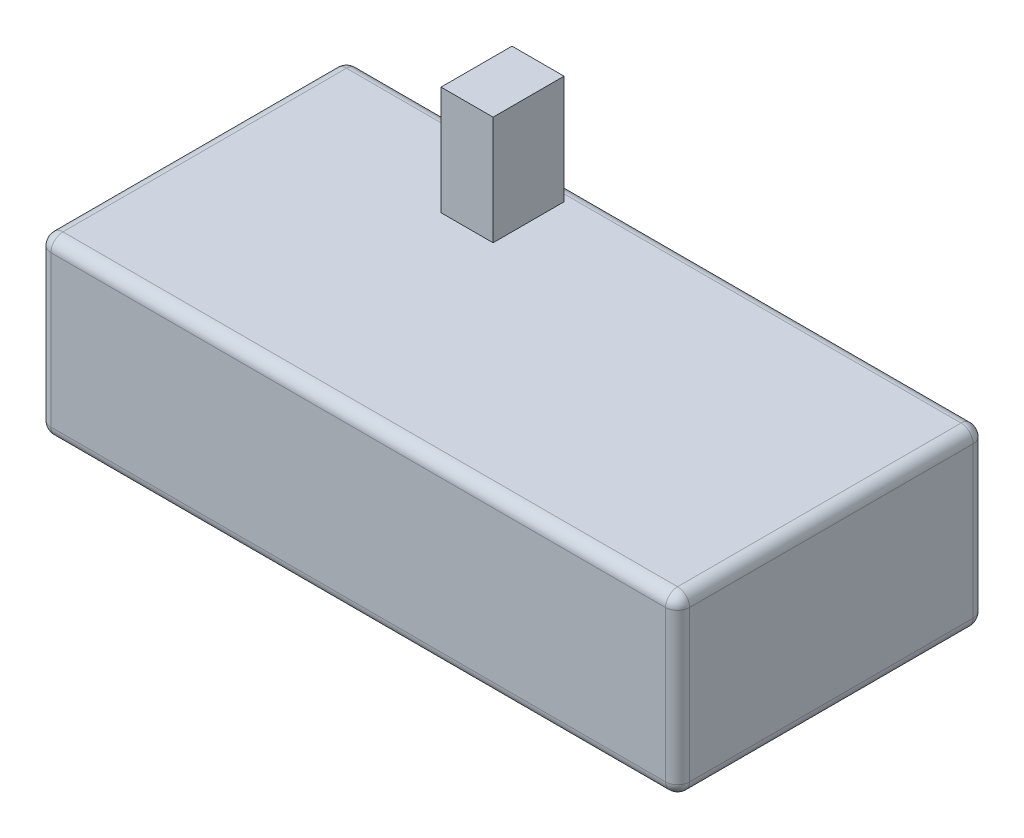
ISO-10303-21;
HEADER;
FILE_DESCRIPTION(('STEP AP214'),'2;1');
FILE_NAME('part.step','',(''),(''),'','','');
FILE_SCHEMA(('AUTOMOTIVE_DESIGN { 1 0 10303 214 1 1 1 1 }'));
ENDSEC;
DATA;
#1=APPLICATION_CONTEXT('core data for automotive mechanical design processes');
#2=APPLICATION_PROTOCOL_DEFINITION('international standard','automotive_design',2000,#1);
#3=PRODUCT_CONTEXT('',#1,'mechanical');
#4=PRODUCT('Part','Part','',(#3));
#5=PRODUCT_RELATED_PRODUCT_CATEGORY('part','',(#4));
#6=PRODUCT_DEFINITION_FORMATION('','',#4);
#7=PRODUCT_DEFINITION_CONTEXT('part definition',#1,'design');
#8=PRODUCT_DEFINITION('design','',#6,#7);
#9=PRODUCT_DEFINITION_SHAPE('','',#8);
#10=(LENGTH_UNIT() NAMED_UNIT(*) SI_UNIT(.MILLI.,.METRE.));
#11=(NAMED_UNIT(*) PLANE_ANGLE_UNIT() SI_UNIT($,.RADIAN.));
#12=(NAMED_UNIT(*) SI_UNIT($,.STERADIAN.) SOLID_ANGLE_UNIT());
#13=UNCERTAINTY_MEASURE_WITH_UNIT(LENGTH_MEASURE(1.E-05),#10,'distance_accuracy_value','');
#14=(GEOMETRIC_REPRESENTATION_CONTEXT(3) GLOBAL_UNCERTAINTY_ASSIGNED_CONTEXT((#13)) GLOBAL_UNIT_ASSIGNED_CONTEXT((#10,
#11,#12)) REPRESENTATION_CONTEXT('',''));
#15=CARTESIAN_POINT('',(0.,0.,0.));
#16=DIRECTION('',(0.,0.,1.));
#17=DIRECTION('',(1.,0.,0.));
#18=AXIS2_PLACEMENT_3D('',#15,#16,#17);
#19=CARTESIAN_POINT('',(0.,37.,0.));
#20=DIRECTION('',(0.,0.,1.));
#21=DIRECTION('',(1.,0.,0.));
#22=AXIS2_PLACEMENT_3D('',#19,#20,#21);
#23=PLANE('',#22);
#24=DIRECTION('',(0.,-1.,0.));
#25=VECTOR('',#24,1.);
#26=CARTESIAN_POINT('',(132.46,37.,0.));
#27=LINE('',#26,#25);
#28=CARTESIAN_POINT('',(132.46,34.46,0.));
#29=VERTEX_POINT('',#28);
#30=CARTESIAN_POINT('',(132.46,2.54,0.));
#31=VERTEX_POINT('',#30);
#32=EDGE_CURVE('E300',#29,#31,#27,.T.);
#33=ORIENTED_EDGE('',*,*,#32,.T.);
#34=DIRECTION('',(-1.,0.,0.));
#35=VECTOR('',#34,1.);
#36=CARTESIAN_POINT('',(0.,2.54,0.));
#37=LINE('',#36,#35);
#38=CARTESIAN_POINT('',(2.54,2.54,0.));
#39=VERTEX_POINT('',#38);
#40=EDGE_CURVE('E304',#31,#39,#37,.T.);
#41=ORIENTED_EDGE('',*,*,#40,.T.);
#42=DIRECTION('',(0.,-1.,0.));
#43=VECTOR('',#42,1.);
#44=CARTESIAN_POINT('',(2.54,37.,0.));
#45=LINE('',#44,#43);
#46=CARTESIAN_POINT('',(2.54,34.46,0.));
#47=VERTEX_POINT('',#46);
#48=EDGE_CURVE('E302',#39,#47,#45,.F.);
#49=ORIENTED_EDGE('',*,*,#48,.T.);
#50=DIRECTION('',(-1.,0.,0.));
#51=VECTOR('',#50,1.);
#52=CARTESIAN_POINT('',(135.,34.46,0.));
#53=LINE('',#52,#51);
#54=EDGE_CURVE('E298',#47,#29,#53,.F.);
#55=ORIENTED_EDGE('',*,*,#54,.T.);
#56=EDGE_LOOP('',(#33,#41,#49,#55));
#57=FACE_BOUND('',#56,.T.);
#58=DIRECTION('',(0.,-1.,0.));
#59=VECTOR('',#58,1.);
#60=CARTESIAN_POINT('',(66.,12.,0.));
#61=LINE('',#60,#59);
#62=CARTESIAN_POINT('',(66.,12.,0.));
#63=VERTEX_POINT('',#62);
#64=CARTESIAN_POINT('',(66.,8.,0.));
#65=VERTEX_POINT('',#64);
#66=EDGE_CURVE('E235',#63,#65,#61,.T.);
#67=ORIENTED_EDGE('',*,*,#66,.F.);
#68=DIRECTION('',(1.,0.,0.));
#69=VECTOR('',#68,1.);
#70=CARTESIAN_POINT('',(66.,12.,0.));
#71=LINE('',#70,#69);
#72=CARTESIAN_POINT('',(53.,12.,0.));
#73=VERTEX_POINT('',#72);
#74=EDGE_CURVE('E240',#73,#63,#71,.T.);
#75=ORIENTED_EDGE('',*,*,#74,.F.);
#76=DIRECTION('',(0.,1.,0.));
#77=VECTOR('',#76,1.);
#78=CARTESIAN_POINT('',(53.,12.,0.));
#79=LINE('',#78,#77);
#80=CARTESIAN_POINT('',(53.,8.00000000000001,0.));
#81=VERTEX_POINT('',#80);
#82=EDGE_CURVE('E252',#81,#73,#79,.T.);
#83=ORIENTED_EDGE('',*,*,#82,.F.);
#84=DIRECTION('',(-1.,0.,0.));
#85=VECTOR('',#84,1.);
#86=CARTESIAN_POINT('',(66.,8.,0.));
#87=LINE('',#86,#85);
#88=EDGE_CURVE('E249',#65,#81,#87,.T.);
#89=ORIENTED_EDGE('',*,*,#88,.F.);
#90=EDGE_LOOP('',(#67,#75,#83,#89));
#91=FACE_BOUND('',#90,.T.);
#92=ADVANCED_FACE('F35',(#57,#91),#23,.F.);
#93=CARTESIAN_POINT('',(0.,37.,0.));
#94=DIRECTION('',(0.,1.,0.));
#95=DIRECTION('',(0.,0.,1.));
#96=AXIS2_PLACEMENT_3D('',#93,#94,#95);
#97=PLANE('',#96);
#98=DIRECTION('',(0.,0.,-1.));
#99=VECTOR('',#98,1.);
#100=CARTESIAN_POINT('',(132.46,37.,0.));
#101=LINE('',#100,#99);
#102=CARTESIAN_POINT('',(132.46,37.,62.46));
#103=VERTEX_POINT('',#102);
#104=CARTESIAN_POINT('',(132.46,37.,2.54));
#105=VERTEX_POINT('',#104);
#106=EDGE_CURVE('E44',#103,#105,#101,.T.);
#107=ORIENTED_EDGE('',*,*,#106,.T.);
#108=DIRECTION('',(-1.,0.,0.));
#109=VECTOR('',#108,1.);
#110=CARTESIAN_POINT('',(0.,37.,2.54));
#111=LINE('',#110,#109);
#112=CARTESIAN_POINT('',(2.54,37.,2.54));
#113=VERTEX_POINT('',#112);
#114=EDGE_CURVE('E11',#105,#113,#111,.T.);
#115=ORIENTED_EDGE('',*,*,#114,.T.);
#116=DIRECTION('',(0.,0.,1.));
#117=VECTOR('',#116,1.);
#118=CARTESIAN_POINT('',(2.54,37.,65.));
#119=LINE('',#118,#117);
#120=CARTESIAN_POINT('',(2.54,37.,62.46));
#121=VERTEX_POINT('',#120);
#122=EDGE_CURVE('E343',#113,#121,#119,.T.);
#123=ORIENTED_EDGE('',*,*,#122,.T.);
#124=DIRECTION('',(1.,0.,0.));
#125=VECTOR('',#124,1.);
#126=CARTESIAN_POINT('',(135.,37.,62.46));
#127=LINE('',#126,#125);
#128=EDGE_CURVE('E345',#121,#103,#127,.T.);
#129=ORIENTED_EDGE('',*,*,#128,.T.);
#130=EDGE_LOOP('',(#107,#115,#123,#129));
#131=FACE_BOUND('',#130,.T.);
#132=DIRECTION('',(-1.,0.,0.));
#133=VECTOR('',#132,1.);
#134=CARTESIAN_POINT('',(50.,37.,4.));
#135=LINE('',#134,#133);
#136=CARTESIAN_POINT('',(50.,37.,4.));
#137=VERTEX_POINT('',#136);
#138=CARTESIAN_POINT('',(39.,37.,4.00000000000001));
#139=VERTEX_POINT('',#138);
#140=EDGE_CURVE('E282',#137,#139,#135,.T.);
#141=ORIENTED_EDGE('',*,*,#140,.F.);
#142=DIRECTION('',(0.,0.,-1.));
#143=VECTOR('',#142,1.);
#144=CARTESIAN_POINT('',(50.,37.,19.));
#145=LINE('',#144,#143);
#146=CARTESIAN_POINT('',(50.,37.,19.));
#147=VERTEX_POINT('',#146);
#148=EDGE_CURVE('E268',#147,#137,#145,.T.);
#149=ORIENTED_EDGE('',*,*,#148,.F.);
#150=DIRECTION('',(1.,0.,0.));
#151=VECTOR('',#150,1.);
#152=CARTESIAN_POINT('',(50.,37.,19.));
#153=LINE('',#152,#151);
#154=CARTESIAN_POINT('',(39.,37.,19.));
#155=VERTEX_POINT('',#154);
#156=EDGE_CURVE('E273',#155,#147,#153,.T.);
#157=ORIENTED_EDGE('',*,*,#156,.F.);
#158=DIRECTION('',(0.,0.,1.));
#159=VECTOR('',#158,1.);
#160=CARTESIAN_POINT('',(39.,37.,19.));
#161=LINE('',#160,#159);
#162=EDGE_CURVE('E284',#139,#155,#161,.T.);
#163=ORIENTED_EDGE('',*,*,#162,.F.);
#164=EDGE_LOOP('',(#141,#149,#157,#163));
#165=FACE_BOUND('',#164,.T.);
#166=ADVANCED_FACE('F438',(#131,#165),#97,.T.);
#167=CARTESIAN_POINT('',(0.,37.,0.));
#168=DIRECTION('',(1.,0.,0.));
#169=DIRECTION('',(0.,0.,-1.));
#170=AXIS2_PLACEMENT_3D('',#167,#168,#169);
#171=PLANE('',#170);
#172=DIRECTION('',(0.,0.,1.));
#173=VECTOR('',#172,1.);
#174=CARTESIAN_POINT('',(0.,34.46,0.));
#175=LINE('',#174,#173);
#176=CARTESIAN_POINT('',(0.,34.46,62.46));
#177=VERTEX_POINT('',#176);
#178=CARTESIAN_POINT('',(0.,34.46,2.54));
#179=VERTEX_POINT('',#178);
#180=EDGE_CURVE('E316',#177,#179,#175,.F.);
#181=ORIENTED_EDGE('',*,*,#180,.T.);
#182=DIRECTION('',(0.,-1.,0.));
#183=VECTOR('',#182,1.);
#184=CARTESIAN_POINT('',(0.,37.,2.54));
#185=LINE('',#184,#183);
#186=CARTESIAN_POINT('',(0.,2.54,2.54));
#187=VERTEX_POINT('',#186);
#188=EDGE_CURVE('E322',#179,#187,#185,.T.);
#189=ORIENTED_EDGE('',*,*,#188,.T.);
#190=DIRECTION('',(0.,0.,1.));
#191=VECTOR('',#190,1.);
#192=CARTESIAN_POINT('',(0.,2.54,0.));
#193=LINE('',#192,#191);
#194=CARTESIAN_POINT('',(0.,2.54,62.46));
#195=VERTEX_POINT('',#194);
#196=EDGE_CURVE('E320',#187,#195,#193,.T.);
#197=ORIENTED_EDGE('',*,*,#196,.T.);
#198=DIRECTION('',(0.,-1.,0.));
#199=VECTOR('',#198,1.);
#200=CARTESIAN_POINT('',(0.,37.,62.46));
#201=LINE('',#200,#199);
#202=EDGE_CURVE('E318',#195,#177,#201,.F.);
#203=ORIENTED_EDGE('',*,*,#202,.T.);
#204=EDGE_LOOP('',(#181,#189,#197,#203));
#205=FACE_BOUND('',#204,.T.);
#206=ADVANCED_FACE('F500',(#205),#171,.F.);
#207=CARTESIAN_POINT('',(0.,37.,65.));
#208=DIRECTION('',(0.,0.,-1.));
#209=DIRECTION('',(-1.,0.,0.));
#210=AXIS2_PLACEMENT_3D('',#207,#208,#209);
#211=PLANE('',#210);
#212=DIRECTION('',(1.,0.,0.));
#213=VECTOR('',#212,1.);
#214=CARTESIAN_POINT('',(0.,34.46,65.));
#215=LINE('',#214,#213);
#216=CARTESIAN_POINT('',(132.46,34.46,65.));
#217=VERTEX_POINT('',#216);
#218=CARTESIAN_POINT('',(2.54,34.46,65.));
#219=VERTEX_POINT('',#218);
#220=EDGE_CURVE('E325',#217,#219,#215,.F.);
#221=ORIENTED_EDGE('',*,*,#220,.T.);
#222=DIRECTION('',(0.,-1.,0.));
#223=VECTOR('',#222,1.);
#224=CARTESIAN_POINT('',(2.54,37.,65.));
#225=LINE('',#224,#223);
#226=CARTESIAN_POINT('',(2.54,2.54,65.));
#227=VERTEX_POINT('',#226);
#228=EDGE_CURVE('E331',#219,#227,#225,.T.);
#229=ORIENTED_EDGE('',*,*,#228,.T.);
#230=DIRECTION('',(1.,0.,0.));
#231=VECTOR('',#230,1.);
#232=CARTESIAN_POINT('',(0.,2.54,65.));
#233=LINE('',#232,#231);
#234=CARTESIAN_POINT('',(132.46,2.54,65.));
#235=VERTEX_POINT('',#234);
#236=EDGE_CURVE('E329',#227,#235,#233,.T.);
#237=ORIENTED_EDGE('',*,*,#236,.T.);
#238=DIRECTION('',(0.,-1.,0.));
#239=VECTOR('',#238,1.);
#240=CARTESIAN_POINT('',(132.46,37.,65.));
#241=LINE('',#240,#239);
#242=EDGE_CURVE('E327',#235,#217,#241,.F.);
#243=ORIENTED_EDGE('',*,*,#242,.T.);
#244=EDGE_LOOP('',(#221,#229,#237,#243));
#245=FACE_BOUND('',#244,.T.);
#246=ADVANCED_FACE('F461',(#245),#211,.F.);
#247=CARTESIAN_POINT('',(135.,37.,0.));
#248=DIRECTION('',(-1.,0.,0.));
#249=DIRECTION('',(0.,0.,1.));
#250=AXIS2_PLACEMENT_3D('',#247,#248,#249);
#251=PLANE('',#250);
#252=DIRECTION('',(0.,-1.,0.));
#253=VECTOR('',#252,1.);
#254=CARTESIAN_POINT('',(135.,37.,62.46));
#255=LINE('',#254,#253);
#256=CARTESIAN_POINT('',(135.,34.46,62.46));
#257=VERTEX_POINT('',#256);
#258=CARTESIAN_POINT('',(135.,2.54,62.46));
#259=VERTEX_POINT('',#258);
#260=EDGE_CURVE('E338',#257,#259,#255,.T.);
#261=ORIENTED_EDGE('',*,*,#260,.T.);
#262=DIRECTION('',(0.,0.,-1.));
#263=VECTOR('',#262,1.);
#264=CARTESIAN_POINT('',(135.,2.54,0.));
#265=LINE('',#264,#263);
#266=CARTESIAN_POINT('',(135.,2.54,2.54));
#267=VERTEX_POINT('',#266);
#268=EDGE_CURVE('E341',#259,#267,#265,.T.);
#269=ORIENTED_EDGE('',*,*,#268,.T.);
#270=DIRECTION('',(0.,-1.,0.));
#271=VECTOR('',#270,1.);
#272=CARTESIAN_POINT('',(135.,37.,2.54));
#273=LINE('',#272,#271);
#274=CARTESIAN_POINT('',(135.,34.46,2.54));
#275=VERTEX_POINT('',#274);
#276=EDGE_CURVE('E336',#267,#275,#273,.F.);
#277=ORIENTED_EDGE('',*,*,#276,.T.);
#278=DIRECTION('',(0.,0.,-1.));
#279=VECTOR('',#278,1.);
#280=CARTESIAN_POINT('',(135.,34.46,65.));
#281=LINE('',#280,#279);
#282=EDGE_CURVE('E334',#275,#257,#281,.F.);
#283=ORIENTED_EDGE('',*,*,#282,.T.);
#284=EDGE_LOOP('',(#261,#269,#277,#283));
#285=FACE_BOUND('',#284,.T.);
#286=ADVANCED_FACE('F430',(#285),#251,.F.);
#287=CARTESIAN_POINT('',(0.,0.,0.));
#288=DIRECTION('',(0.,1.,0.));
#289=DIRECTION('',(0.,0.,1.));
#290=AXIS2_PLACEMENT_3D('',#287,#288,#289);
#291=PLANE('',#290);
#292=DIRECTION('',(0.,0.,1.));
#293=VECTOR('',#292,1.);
#294=CARTESIAN_POINT('',(2.54,0.,0.));
#295=LINE('',#294,#293);
#296=CARTESIAN_POINT('',(2.54,0.,62.46));
#297=VERTEX_POINT('',#296);
#298=CARTESIAN_POINT('',(2.54,0.,2.54));
#299=VERTEX_POINT('',#298);
#300=EDGE_CURVE('E311',#297,#299,#295,.F.);
#301=ORIENTED_EDGE('',*,*,#300,.T.);
#302=DIRECTION('',(-1.,0.,0.));
#303=VECTOR('',#302,1.);
#304=CARTESIAN_POINT('',(0.,0.,2.54));
#305=LINE('',#304,#303);
#306=CARTESIAN_POINT('',(132.46,0.,2.54));
#307=VERTEX_POINT('',#306);
#308=EDGE_CURVE('E313',#299,#307,#305,.F.);
#309=ORIENTED_EDGE('',*,*,#308,.T.);
#310=DIRECTION('',(0.,0.,-1.));
#311=VECTOR('',#310,1.);
#312=CARTESIAN_POINT('',(132.46,0.,0.));
#313=LINE('',#312,#311);
#314=CARTESIAN_POINT('',(132.46,0.,62.46));
#315=VERTEX_POINT('',#314);
#316=EDGE_CURVE('E307',#307,#315,#313,.F.);
#317=ORIENTED_EDGE('',*,*,#316,.T.);
#318=DIRECTION('',(1.,0.,0.));
#319=VECTOR('',#318,1.);
#320=CARTESIAN_POINT('',(0.,0.,62.46));
#321=LINE('',#320,#319);
#322=EDGE_CURVE('E309',#315,#297,#321,.F.);
#323=ORIENTED_EDGE('',*,*,#322,.T.);
#324=EDGE_LOOP('',(#301,#309,#317,#323));
#325=FACE_BOUND('',#324,.T.);
#326=ADVANCED_FACE('F505',(#325),#291,.F.);
#327=CARTESIAN_POINT('',(0.,34.46,62.46));
#328=DIRECTION('',(-1.,0.,0.));
#329=DIRECTION('',(0.,0.,1.));
#330=AXIS2_PLACEMENT_3D('',#327,#328,#329);
#331=CYLINDRICAL_SURFACE('',#330,2.54);
#332=CARTESIAN_POINT('',(132.46,34.46,62.46));
#333=DIRECTION('',(1.,0.,0.));
#334=DIRECTION('',(0.,0.,-1.));
#335=AXIS2_PLACEMENT_3D('',#332,#333,#334);
#336=CIRCLE('',#335,2.54);
#337=EDGE_CURVE('E39',#103,#217,#336,.T.);
#338=ORIENTED_EDGE('',*,*,#337,.F.);
#339=ORIENTED_EDGE('',*,*,#128,.F.);
#340=CARTESIAN_POINT('',(2.54,34.46,62.46));
#341=DIRECTION('',(-1.,0.,0.));
#342=DIRECTION('',(0.,0.,1.));
#343=AXIS2_PLACEMENT_3D('',#340,#341,#342);
#344=CIRCLE('',#343,2.54);
#345=EDGE_CURVE('E407',#219,#121,#344,.T.);
#346=ORIENTED_EDGE('',*,*,#345,.F.);
#347=ORIENTED_EDGE('',*,*,#220,.F.);
#348=EDGE_LOOP('',(#338,#339,#346,#347));
#349=FACE_BOUND('',#348,.T.);
#350=ADVANCED_FACE('F37',(#349),#331,.T.);
#351=CARTESIAN_POINT('',(132.46,34.46,62.46));
#352=DIRECTION('',(0.,0.,1.));
#353=DIRECTION('',(1.,0.,0.));
#354=AXIS2_PLACEMENT_3D('',#351,#352,#353);
#355=SPHERICAL_SURFACE('',#354,2.54);
#356=CARTESIAN_POINT('',(132.46,34.46,62.46));
#357=DIRECTION('',(0.,0.,1.));
#358=DIRECTION('',(1.,0.,0.));
#359=AXIS2_PLACEMENT_3D('',#356,#357,#358);
#360=CIRCLE('',#359,2.54);
#361=EDGE_CURVE('E402',#103,#257,#360,.F.);
#362=ORIENTED_EDGE('',*,*,#361,.F.);
#363=ORIENTED_EDGE('',*,*,#337,.T.);
#364=CARTESIAN_POINT('',(132.46,34.46,62.46));
#365=DIRECTION('',(0.,1.,0.));
#366=DIRECTION('',(0.,0.,1.));
#367=AXIS2_PLACEMENT_3D('',#364,#365,#366);
#368=CIRCLE('',#367,2.54);
#369=EDGE_CURVE('E405',#257,#217,#368,.F.);
#370=ORIENTED_EDGE('',*,*,#369,.F.);
#371=EDGE_LOOP('',(#362,#363,#370));
#372=FACE_BOUND('',#371,.T.);
#373=ADVANCED_FACE('F418',(#372),#355,.T.);
#374=CARTESIAN_POINT('',(2.54,34.46,62.46));
#375=DIRECTION('',(0.,0.,1.));
#376=DIRECTION('',(1.,0.,0.));
#377=AXIS2_PLACEMENT_3D('',#374,#375,#376);
#378=SPHERICAL_SURFACE('',#377,2.54);
#379=CARTESIAN_POINT('',(2.54,34.46,62.46));
#380=DIRECTION('',(0.,1.,0.));
#381=DIRECTION('',(0.,0.,1.));
#382=AXIS2_PLACEMENT_3D('',#379,#380,#381);
#383=CIRCLE('',#382,2.54);
#384=EDGE_CURVE('E396',#219,#177,#383,.F.);
#385=ORIENTED_EDGE('',*,*,#384,.F.);
#386=ORIENTED_EDGE('',*,*,#345,.T.);
#387=CARTESIAN_POINT('',(2.54,34.46,62.46));
#388=DIRECTION('',(0.,0.,1.));
#389=DIRECTION('',(1.,0.,0.));
#390=AXIS2_PLACEMENT_3D('',#387,#388,#389);
#391=CIRCLE('',#390,2.54);
#392=EDGE_CURVE('E399',#177,#121,#391,.F.);
#393=ORIENTED_EDGE('',*,*,#392,.F.);
#394=EDGE_LOOP('',(#385,#386,#393));
#395=FACE_BOUND('',#394,.T.);
#396=ADVANCED_FACE('F454',(#395),#378,.T.);
#397=CARTESIAN_POINT('',(132.46,37.,62.46));
#398=DIRECTION('',(0.,-1.,0.));
#399=DIRECTION('',(0.,0.,-1.));
#400=AXIS2_PLACEMENT_3D('',#397,#398,#399);
#401=CYLINDRICAL_SURFACE('',#400,2.54);
#402=ORIENTED_EDGE('',*,*,#369,.T.);
#403=ORIENTED_EDGE('',*,*,#242,.F.);
#404=CARTESIAN_POINT('',(132.46,2.54,62.46));
#405=DIRECTION('',(0.,-1.,0.));
#406=DIRECTION('',(0.,0.,-1.));
#407=AXIS2_PLACEMENT_3D('',#404,#405,#406);
#408=CIRCLE('',#407,2.54);
#409=EDGE_CURVE('E390',#259,#235,#408,.T.);
#410=ORIENTED_EDGE('',*,*,#409,.F.);
#411=ORIENTED_EDGE('',*,*,#260,.F.);
#412=EDGE_LOOP('',(#402,#403,#410,#411));
#413=FACE_BOUND('',#412,.T.);
#414=ADVANCED_FACE('F426',(#413),#401,.T.);
#415=CARTESIAN_POINT('',(132.46,34.46,0.));
#416=DIRECTION('',(0.,0.,1.));
#417=DIRECTION('',(1.,0.,0.));
#418=AXIS2_PLACEMENT_3D('',#415,#416,#417);
#419=CYLINDRICAL_SURFACE('',#418,2.54);
#420=ORIENTED_EDGE('',*,*,#361,.T.);
#421=ORIENTED_EDGE('',*,*,#282,.F.);
#422=CARTESIAN_POINT('',(132.46,34.46,2.54));
#423=DIRECTION('',(0.,0.,-1.));
#424=DIRECTION('',(-1.,0.,0.));
#425=AXIS2_PLACEMENT_3D('',#422,#423,#424);
#426=CIRCLE('',#425,2.54);
#427=EDGE_CURVE('E387',#105,#275,#426,.T.);
#428=ORIENTED_EDGE('',*,*,#427,.F.);
#429=ORIENTED_EDGE('',*,*,#106,.F.);
#430=EDGE_LOOP('',(#420,#421,#428,#429));
#431=FACE_BOUND('',#430,.T.);
#432=ADVANCED_FACE('F435',(#431),#419,.T.);
#433=CARTESIAN_POINT('',(0.,34.46,2.54));
#434=DIRECTION('',(1.,0.,0.));
#435=DIRECTION('',(0.,0.,-1.));
#436=AXIS2_PLACEMENT_3D('',#433,#434,#435);
#437=CYLINDRICAL_SURFACE('',#436,2.54);
#438=CARTESIAN_POINT('',(2.54,34.46,2.54));
#439=DIRECTION('',(-1.,0.,0.));
#440=DIRECTION('',(0.,0.,1.));
#441=AXIS2_PLACEMENT_3D('',#438,#439,#440);
#442=CIRCLE('',#441,2.54);
#443=EDGE_CURVE('E381',#113,#47,#442,.T.);
#444=ORIENTED_EDGE('',*,*,#443,.F.);
#445=ORIENTED_EDGE('',*,*,#114,.F.);
#446=CARTESIAN_POINT('',(132.46,34.46,2.54));
#447=DIRECTION('',(1.,0.,0.));
#448=DIRECTION('',(0.,0.,-1.));
#449=AXIS2_PLACEMENT_3D('',#446,#447,#448);
#450=CIRCLE('',#449,2.54);
#451=EDGE_CURVE('E384',#29,#105,#450,.T.);
#452=ORIENTED_EDGE('',*,*,#451,.F.);
#453=ORIENTED_EDGE('',*,*,#54,.F.);
#454=EDGE_LOOP('',(#444,#445,#452,#453));
#455=FACE_BOUND('',#454,.T.);
#456=ADVANCED_FACE('F443',(#455),#437,.T.);
#457=CARTESIAN_POINT('',(2.54,34.46,0.));
#458=DIRECTION('',(0.,0.,-1.));
#459=DIRECTION('',(-1.,0.,0.));
#460=AXIS2_PLACEMENT_3D('',#457,#458,#459);
#461=CYLINDRICAL_SURFACE('',#460,2.54);
#462=ORIENTED_EDGE('',*,*,#392,.T.);
#463=ORIENTED_EDGE('',*,*,#122,.F.);
#464=CARTESIAN_POINT('',(2.54,34.46,2.54));
#465=DIRECTION('',(0.,0.,-1.));
#466=DIRECTION('',(-1.,0.,0.));
#467=AXIS2_PLACEMENT_3D('',#464,#465,#466);
#468=CIRCLE('',#467,2.54);
#469=EDGE_CURVE('E379',#179,#113,#468,.T.);
#470=ORIENTED_EDGE('',*,*,#469,.F.);
#471=ORIENTED_EDGE('',*,*,#180,.F.);
#472=EDGE_LOOP('',(#462,#463,#470,#471));
#473=FACE_BOUND('',#472,.T.);
#474=ADVANCED_FACE('F451',(#473),#461,.T.);
#475=CARTESIAN_POINT('',(2.54,37.,62.46));
#476=DIRECTION('',(0.,-1.,0.));
#477=DIRECTION('',(0.,0.,-1.));
#478=AXIS2_PLACEMENT_3D('',#475,#476,#477);
#479=CYLINDRICAL_SURFACE('',#478,2.54);
#480=ORIENTED_EDGE('',*,*,#384,.T.);
#481=ORIENTED_EDGE('',*,*,#202,.F.);
#482=CARTESIAN_POINT('',(2.54,2.54,62.46));
#483=DIRECTION('',(0.,-1.,0.));
#484=DIRECTION('',(0.,0.,-1.));
#485=AXIS2_PLACEMENT_3D('',#482,#483,#484);
#486=CIRCLE('',#485,2.54);
#487=EDGE_CURVE('E376',#227,#195,#486,.T.);
#488=ORIENTED_EDGE('',*,*,#487,.F.);
#489=ORIENTED_EDGE('',*,*,#228,.F.);
#490=EDGE_LOOP('',(#480,#481,#488,#489));
#491=FACE_BOUND('',#490,.T.);
#492=ADVANCED_FACE('F458',(#491),#479,.T.);
#493=CARTESIAN_POINT('',(0.,2.54,62.46));
#494=DIRECTION('',(1.,0.,0.));
#495=DIRECTION('',(0.,0.,-1.));
#496=AXIS2_PLACEMENT_3D('',#493,#494,#495);
#497=CYLINDRICAL_SURFACE('',#496,2.54);
#498=CARTESIAN_POINT('',(132.46,2.54,62.46));
#499=DIRECTION('',(1.,0.,0.));
#500=DIRECTION('',(0.,0.,-1.));
#501=AXIS2_PLACEMENT_3D('',#498,#499,#500);
#502=CIRCLE('',#501,2.54);
#503=EDGE_CURVE('E393',#235,#315,#502,.T.);
#504=ORIENTED_EDGE('',*,*,#503,.F.);
#505=ORIENTED_EDGE('',*,*,#236,.F.);
#506=CARTESIAN_POINT('',(2.54,2.54,62.46));
#507=DIRECTION('',(-1.,0.,0.));
#508=DIRECTION('',(0.,0.,1.));
#509=AXIS2_PLACEMENT_3D('',#506,#507,#508);
#510=CIRCLE('',#509,2.54);
#511=EDGE_CURVE('E374',#297,#227,#510,.T.);
#512=ORIENTED_EDGE('',*,*,#511,.F.);
#513=ORIENTED_EDGE('',*,*,#322,.F.);
#514=EDGE_LOOP('',(#504,#505,#512,#513));
#515=FACE_BOUND('',#514,.T.);
#516=ADVANCED_FACE('F464',(#515),#497,.T.);
#517=CARTESIAN_POINT('',(132.46,2.54,62.46));
#518=DIRECTION('',(0.,0.,1.));
#519=DIRECTION('',(1.,0.,0.));
#520=AXIS2_PLACEMENT_3D('',#517,#518,#519);
#521=SPHERICAL_SURFACE('',#520,2.54);
#522=ORIENTED_EDGE('',*,*,#409,.T.);
#523=ORIENTED_EDGE('',*,*,#503,.T.);
#524=CARTESIAN_POINT('',(132.46,2.54,62.46));
#525=DIRECTION('',(0.,0.,1.));
#526=DIRECTION('',(1.,0.,0.));
#527=AXIS2_PLACEMENT_3D('',#524,#525,#526);
#528=CIRCLE('',#527,2.54);
#529=EDGE_CURVE('E371',#259,#315,#528,.F.);
#530=ORIENTED_EDGE('',*,*,#529,.F.);
#531=EDGE_LOOP('',(#522,#523,#530));
#532=FACE_BOUND('',#531,.T.);
#533=ADVANCED_FACE('F469',(#532),#521,.T.);
#534=CARTESIAN_POINT('',(132.46,34.46,2.54));
#535=DIRECTION('',(0.,0.,1.));
#536=DIRECTION('',(1.,0.,0.));
#537=AXIS2_PLACEMENT_3D('',#534,#535,#536);
#538=SPHERICAL_SURFACE('',#537,2.54);
#539=ORIENTED_EDGE('',*,*,#451,.T.);
#540=ORIENTED_EDGE('',*,*,#427,.T.);
#541=CARTESIAN_POINT('',(132.46,34.46,2.54));
#542=DIRECTION('',(0.,1.,0.));
#543=DIRECTION('',(0.,0.,1.));
#544=AXIS2_PLACEMENT_3D('',#541,#542,#543);
#545=CIRCLE('',#544,2.54);
#546=EDGE_CURVE('E368',#29,#275,#545,.F.);
#547=ORIENTED_EDGE('',*,*,#546,.F.);
#548=EDGE_LOOP('',(#539,#540,#547));
#549=FACE_BOUND('',#548,.T.);
#550=ADVANCED_FACE('F483',(#549),#538,.T.);
#551=CARTESIAN_POINT('',(2.54,34.46,2.54));
#552=DIRECTION('',(0.,0.,1.));
#553=DIRECTION('',(1.,0.,0.));
#554=AXIS2_PLACEMENT_3D('',#551,#552,#553);
#555=SPHERICAL_SURFACE('',#554,2.54);
#556=ORIENTED_EDGE('',*,*,#469,.T.);
#557=ORIENTED_EDGE('',*,*,#443,.T.);
#558=CARTESIAN_POINT('',(2.54,34.46,2.54));
#559=DIRECTION('',(0.,1.,0.));
#560=DIRECTION('',(0.,0.,1.));
#561=AXIS2_PLACEMENT_3D('',#558,#559,#560);
#562=CIRCLE('',#561,2.54);
#563=EDGE_CURVE('E365',#179,#47,#562,.F.);
#564=ORIENTED_EDGE('',*,*,#563,.F.);
#565=EDGE_LOOP('',(#556,#557,#564));
#566=FACE_BOUND('',#565,.T.);
#567=ADVANCED_FACE('F485',(#566),#555,.T.);
#568=CARTESIAN_POINT('',(2.54,2.54,62.46));
#569=DIRECTION('',(0.,0.,1.));
#570=DIRECTION('',(1.,0.,0.));
#571=AXIS2_PLACEMENT_3D('',#568,#569,#570);
#572=SPHERICAL_SURFACE('',#571,2.54);
#573=ORIENTED_EDGE('',*,*,#511,.T.);
#574=ORIENTED_EDGE('',*,*,#487,.T.);
#575=CARTESIAN_POINT('',(2.54,2.54,62.46));
#576=DIRECTION('',(0.,0.,1.));
#577=DIRECTION('',(1.,0.,0.));
#578=AXIS2_PLACEMENT_3D('',#575,#576,#577);
#579=CIRCLE('',#578,2.54);
#580=EDGE_CURVE('E362',#297,#195,#579,.F.);
#581=ORIENTED_EDGE('',*,*,#580,.F.);
#582=EDGE_LOOP('',(#573,#574,#581));
#583=FACE_BOUND('',#582,.T.);
#584=ADVANCED_FACE('F491',(#583),#572,.T.);
#585=CARTESIAN_POINT('',(132.46,2.54,0.));
#586=DIRECTION('',(0.,0.,-1.));
#587=DIRECTION('',(-1.,0.,0.));
#588=AXIS2_PLACEMENT_3D('',#585,#586,#587);
#589=CYLINDRICAL_SURFACE('',#588,2.54);
#590=ORIENTED_EDGE('',*,*,#529,.T.);
#591=ORIENTED_EDGE('',*,*,#316,.F.);
#592=CARTESIAN_POINT('',(132.46,2.54,2.54));
#593=DIRECTION('',(0.,0.,-1.));
#594=DIRECTION('',(-1.,0.,0.));
#595=AXIS2_PLACEMENT_3D('',#592,#593,#594);
#596=CIRCLE('',#595,2.54);
#597=EDGE_CURVE('E359',#267,#307,#596,.T.);
#598=ORIENTED_EDGE('',*,*,#597,.F.);
#599=ORIENTED_EDGE('',*,*,#268,.F.);
#600=EDGE_LOOP('',(#590,#591,#598,#599));
#601=FACE_BOUND('',#600,.T.);
#602=ADVANCED_FACE('F472',(#601),#589,.T.);
#603=CARTESIAN_POINT('',(132.46,37.,2.54));
#604=DIRECTION('',(0.,-1.,0.));
#605=DIRECTION('',(0.,0.,-1.));
#606=AXIS2_PLACEMENT_3D('',#603,#604,#605);
#607=CYLINDRICAL_SURFACE('',#606,2.54);
#608=ORIENTED_EDGE('',*,*,#546,.T.);
#609=ORIENTED_EDGE('',*,*,#276,.F.);
#610=CARTESIAN_POINT('',(132.46,2.54,2.54));
#611=DIRECTION('',(0.,-1.,0.));
#612=DIRECTION('',(0.,0.,-1.));
#613=AXIS2_PLACEMENT_3D('',#610,#611,#612);
#614=CIRCLE('',#613,2.54);
#615=EDGE_CURVE('E356',#31,#267,#614,.T.);
#616=ORIENTED_EDGE('',*,*,#615,.F.);
#617=ORIENTED_EDGE('',*,*,#32,.F.);
#618=EDGE_LOOP('',(#608,#609,#616,#617));
#619=FACE_BOUND('',#618,.T.);
#620=ADVANCED_FACE('F481',(#619),#607,.T.);
#621=CARTESIAN_POINT('',(2.54,37.,2.54));
#622=DIRECTION('',(0.,-1.,0.));
#623=DIRECTION('',(0.,0.,-1.));
#624=AXIS2_PLACEMENT_3D('',#621,#622,#623);
#625=CYLINDRICAL_SURFACE('',#624,2.54);
#626=ORIENTED_EDGE('',*,*,#563,.T.);
#627=ORIENTED_EDGE('',*,*,#48,.F.);
#628=CARTESIAN_POINT('',(2.54,2.54,2.54));
#629=DIRECTION('',(0.,-1.,0.));
#630=DIRECTION('',(0.,0.,-1.));
#631=AXIS2_PLACEMENT_3D('',#628,#629,#630);
#632=CIRCLE('',#631,2.54);
#633=EDGE_CURVE('E353',#187,#39,#632,.T.);
#634=ORIENTED_EDGE('',*,*,#633,.F.);
#635=ORIENTED_EDGE('',*,*,#188,.F.);
#636=EDGE_LOOP('',(#626,#627,#634,#635));
#637=FACE_BOUND('',#636,.T.);
#638=ADVANCED_FACE('F527',(#637),#625,.T.);
#639=CARTESIAN_POINT('',(2.54,2.54,0.));
#640=DIRECTION('',(0.,0.,1.));
#641=DIRECTION('',(1.,0.,0.));
#642=AXIS2_PLACEMENT_3D('',#639,#640,#641);
#643=CYLINDRICAL_SURFACE('',#642,2.54);
#644=ORIENTED_EDGE('',*,*,#580,.T.);
#645=ORIENTED_EDGE('',*,*,#196,.F.);
#646=CARTESIAN_POINT('',(2.54,2.54,2.54));
#647=DIRECTION('',(0.,0.,-1.));
#648=DIRECTION('',(-1.,0.,0.));
#649=AXIS2_PLACEMENT_3D('',#646,#647,#648);
#650=CIRCLE('',#649,2.54);
#651=EDGE_CURVE('E351',#299,#187,#650,.T.);
#652=ORIENTED_EDGE('',*,*,#651,.F.);
#653=ORIENTED_EDGE('',*,*,#300,.F.);
#654=EDGE_LOOP('',(#644,#645,#652,#653));
#655=FACE_BOUND('',#654,.T.);
#656=ADVANCED_FACE('F524',(#655),#643,.T.);
#657=CARTESIAN_POINT('',(132.46,2.54,2.54));
#658=DIRECTION('',(0.,0.,1.));
#659=DIRECTION('',(1.,0.,0.));
#660=AXIS2_PLACEMENT_3D('',#657,#658,#659);
#661=SPHERICAL_SURFACE('',#660,2.54);
#662=ORIENTED_EDGE('',*,*,#615,.T.);
#663=ORIENTED_EDGE('',*,*,#597,.T.);
#664=CARTESIAN_POINT('',(132.46,2.54,2.54));
#665=DIRECTION('',(1.,0.,0.));
#666=DIRECTION('',(0.,0.,-1.));
#667=AXIS2_PLACEMENT_3D('',#664,#665,#666);
#668=CIRCLE('',#667,2.54);
#669=EDGE_CURVE('E349',#31,#307,#668,.F.);
#670=ORIENTED_EDGE('',*,*,#669,.F.);
#671=EDGE_LOOP('',(#662,#663,#670));
#672=FACE_BOUND('',#671,.T.);
#673=ADVANCED_FACE('F477',(#672),#661,.T.);
#674=CARTESIAN_POINT('',(2.54,2.54,2.54));
#675=DIRECTION('',(0.,0.,1.));
#676=DIRECTION('',(1.,0.,0.));
#677=AXIS2_PLACEMENT_3D('',#674,#675,#676);
#678=SPHERICAL_SURFACE('',#677,2.54);
#679=ORIENTED_EDGE('',*,*,#651,.T.);
#680=ORIENTED_EDGE('',*,*,#633,.T.);
#681=CARTESIAN_POINT('',(2.54,2.54,2.54));
#682=DIRECTION('',(-1.,0.,0.));
#683=DIRECTION('',(0.,0.,1.));
#684=AXIS2_PLACEMENT_3D('',#681,#682,#683);
#685=CIRCLE('',#684,2.54);
#686=EDGE_CURVE('E297',#299,#39,#685,.F.);
#687=ORIENTED_EDGE('',*,*,#686,.F.);
#688=EDGE_LOOP('',(#679,#680,#687));
#689=FACE_BOUND('',#688,.T.);
#690=ADVANCED_FACE('F517',(#689),#678,.T.);
#691=CARTESIAN_POINT('',(0.,2.54,2.54));
#692=DIRECTION('',(-1.,0.,0.));
#693=DIRECTION('',(0.,0.,1.));
#694=AXIS2_PLACEMENT_3D('',#691,#692,#693);
#695=CYLINDRICAL_SURFACE('',#694,2.54);
#696=ORIENTED_EDGE('',*,*,#669,.T.);
#697=ORIENTED_EDGE('',*,*,#308,.F.);
#698=ORIENTED_EDGE('',*,*,#686,.T.);
#699=ORIENTED_EDGE('',*,*,#40,.F.);
#700=EDGE_LOOP('',(#696,#697,#698,#699));
#701=FACE_BOUND('',#700,.T.);
#702=ADVANCED_FACE('F513',(#701),#695,.T.);
#703=CARTESIAN_POINT('',(50.,60.,19.));
#704=DIRECTION('',(-1.,0.,0.));
#705=DIRECTION('',(0.,0.,1.));
#706=AXIS2_PLACEMENT_3D('',#703,#704,#705);
#707=PLANE('',#706);
#708=ORIENTED_EDGE('',*,*,#148,.T.);
#709=DIRECTION('',(0.,-1.,0.));
#710=VECTOR('',#709,1.);
#711=CARTESIAN_POINT('',(50.,60.,4.));
#712=LINE('',#711,#710);
#713=CARTESIAN_POINT('',(50.,60.,4.));
#714=VERTEX_POINT('',#713);
#715=EDGE_CURVE('E295',#714,#137,#712,.T.);
#716=ORIENTED_EDGE('',*,*,#715,.F.);
#717=DIRECTION('',(0.,0.,-1.));
#718=VECTOR('',#717,1.);
#719=CARTESIAN_POINT('',(50.,60.,19.));
#720=LINE('',#719,#718);
#721=CARTESIAN_POINT('',(50.,60.,19.));
#722=VERTEX_POINT('',#721);
#723=EDGE_CURVE('E269',#722,#714,#720,.T.);
#724=ORIENTED_EDGE('',*,*,#723,.F.);
#725=DIRECTION('',(0.,-1.,0.));
#726=VECTOR('',#725,1.);
#727=CARTESIAN_POINT('',(50.,60.,19.));
#728=LINE('',#727,#726);
#729=EDGE_CURVE('E279',#722,#147,#728,.T.);
#730=ORIENTED_EDGE('',*,*,#729,.T.);
#731=EDGE_LOOP('',(#708,#716,#724,#730));
#732=FACE_BOUND('',#731,.T.);
#733=ADVANCED_FACE('F516',(#732),#707,.F.);
#734=CARTESIAN_POINT('',(50.,60.,4.));
#735=DIRECTION('',(0.,0.,1.));
#736=DIRECTION('',(1.,0.,0.));
#737=AXIS2_PLACEMENT_3D('',#734,#735,#736);
#738=PLANE('',#737);
#739=ORIENTED_EDGE('',*,*,#140,.T.);
#740=DIRECTION('',(0.,-1.,0.));
#741=VECTOR('',#740,1.);
#742=CARTESIAN_POINT('',(39.,60.,4.00000000000001));
#743=LINE('',#742,#741);
#744=CARTESIAN_POINT('',(39.,60.,4.00000000000001));
#745=VERTEX_POINT('',#744);
#746=EDGE_CURVE('E292',#745,#139,#743,.T.);
#747=ORIENTED_EDGE('',*,*,#746,.F.);
#748=DIRECTION('',(-1.,0.,0.));
#749=VECTOR('',#748,1.);
#750=CARTESIAN_POINT('',(50.,60.,4.));
#751=LINE('',#750,#749);
#752=EDGE_CURVE('E272',#714,#745,#751,.T.);
#753=ORIENTED_EDGE('',*,*,#752,.F.);
#754=ORIENTED_EDGE('',*,*,#715,.T.);
#755=EDGE_LOOP('',(#739,#747,#753,#754));
#756=FACE_BOUND('',#755,.T.);
#757=ADVANCED_FACE('F651',(#756),#738,.F.);
#758=CARTESIAN_POINT('',(39.,60.,19.));
#759=DIRECTION('',(1.,0.,0.));
#760=DIRECTION('',(0.,0.,-1.));
#761=AXIS2_PLACEMENT_3D('',#758,#759,#760);
#762=PLANE('',#761);
#763=ORIENTED_EDGE('',*,*,#162,.T.);
#764=DIRECTION('',(0.,-1.,0.));
#765=VECTOR('',#764,1.);
#766=CARTESIAN_POINT('',(39.,60.,19.));
#767=LINE('',#766,#765);
#768=CARTESIAN_POINT('',(39.,60.,19.));
#769=VERTEX_POINT('',#768);
#770=EDGE_CURVE('E290',#769,#155,#767,.T.);
#771=ORIENTED_EDGE('',*,*,#770,.F.);
#772=DIRECTION('',(0.,0.,1.));
#773=VECTOR('',#772,1.);
#774=CARTESIAN_POINT('',(39.,60.,19.));
#775=LINE('',#774,#773);
#776=EDGE_CURVE('E275',#745,#769,#775,.T.);
#777=ORIENTED_EDGE('',*,*,#776,.F.);
#778=ORIENTED_EDGE('',*,*,#746,.T.);
#779=EDGE_LOOP('',(#763,#771,#777,#778));
#780=FACE_BOUND('',#779,.T.);
#781=ADVANCED_FACE('F661',(#780),#762,.F.);
#782=CARTESIAN_POINT('',(50.,60.,19.));
#783=DIRECTION('',(0.,0.,-1.));
#784=DIRECTION('',(-1.,0.,0.));
#785=AXIS2_PLACEMENT_3D('',#782,#783,#784);
#786=PLANE('',#785);
#787=ORIENTED_EDGE('',*,*,#156,.T.);
#788=ORIENTED_EDGE('',*,*,#729,.F.);
#789=DIRECTION('',(1.,0.,0.));
#790=VECTOR('',#789,1.);
#791=CARTESIAN_POINT('',(50.,60.,19.));
#792=LINE('',#791,#790);
#793=EDGE_CURVE('E277',#769,#722,#792,.T.);
#794=ORIENTED_EDGE('',*,*,#793,.F.);
#795=ORIENTED_EDGE('',*,*,#770,.T.);
#796=EDGE_LOOP('',(#787,#788,#794,#795));
#797=FACE_BOUND('',#796,.T.);
#798=ADVANCED_FACE('F671',(#797),#786,.F.);
#799=CARTESIAN_POINT('',(0.,60.,0.));
#800=DIRECTION('',(0.,1.,0.));
#801=DIRECTION('',(0.,0.,1.));
#802=AXIS2_PLACEMENT_3D('',#799,#800,#801);
#803=PLANE('',#802);
#804=ORIENTED_EDGE('',*,*,#723,.T.);
#805=ORIENTED_EDGE('',*,*,#752,.T.);
#806=ORIENTED_EDGE('',*,*,#776,.T.);
#807=ORIENTED_EDGE('',*,*,#793,.T.);
#808=EDGE_LOOP('',(#804,#805,#806,#807));
#809=FACE_BOUND('',#808,.T.);
#810=ADVANCED_FACE('F681',(#809),#803,.T.);
#811=CARTESIAN_POINT('',(66.,12.,-10.));
#812=DIRECTION('',(-1.,0.,0.));
#813=DIRECTION('',(0.,0.,1.));
#814=AXIS2_PLACEMENT_3D('',#811,#812,#813);
#815=PLANE('',#814);
#816=ORIENTED_EDGE('',*,*,#66,.T.);
#817=DIRECTION('',(0.,0.,1.));
#818=VECTOR('',#817,1.);
#819=CARTESIAN_POINT('',(66.,8.,-10.));
#820=LINE('',#819,#818);
#821=CARTESIAN_POINT('',(66.,8.,-10.));
#822=VERTEX_POINT('',#821);
#823=EDGE_CURVE('E265',#822,#65,#820,.T.);
#824=ORIENTED_EDGE('',*,*,#823,.F.);
#825=DIRECTION('',(0.,-1.,0.));
#826=VECTOR('',#825,1.);
#827=CARTESIAN_POINT('',(66.,12.,-10.));
#828=LINE('',#827,#826);
#829=CARTESIAN_POINT('',(66.,12.,-10.));
#830=VERTEX_POINT('',#829);
#831=EDGE_CURVE('E236',#830,#822,#828,.T.);
#832=ORIENTED_EDGE('',*,*,#831,.F.);
#833=DIRECTION('',(0.,0.,1.));
#834=VECTOR('',#833,1.);
#835=CARTESIAN_POINT('',(66.,12.,-10.));
#836=LINE('',#835,#834);
#837=EDGE_CURVE('E246',#830,#63,#836,.T.);
#838=ORIENTED_EDGE('',*,*,#837,.T.);
#839=EDGE_LOOP('',(#816,#824,#832,#838));
#840=FACE_BOUND('',#839,.T.);
#841=ADVANCED_FACE('F690',(#840),#815,.F.);
#842=CARTESIAN_POINT('',(66.,8.,-10.));
#843=DIRECTION('',(0.,1.,0.));
#844=DIRECTION('',(-1.,0.,0.));
#845=AXIS2_PLACEMENT_3D('',#842,#843,#844);
#846=PLANE('',#845);
#847=DIRECTION('',(1.,0.,0.));
#848=VECTOR('',#847,1.);
#849=CARTESIAN_POINT('',(66.,8.,-3.));
#850=LINE('',#849,#848);
#851=CARTESIAN_POINT('',(57.,8.,-3.));
#852=VERTEX_POINT('',#851);
#853=CARTESIAN_POINT('',(62.,8.,-3.));
#854=VERTEX_POINT('',#853);
#855=EDGE_CURVE('E229',#852,#854,#850,.T.);
#856=ORIENTED_EDGE('',*,*,#855,.T.);
#857=DIRECTION('',(0.,0.,-1.));
#858=VECTOR('',#857,1.);
#859=CARTESIAN_POINT('',(62.,8.,-10.));
#860=LINE('',#859,#858);
#861=CARTESIAN_POINT('',(62.,8.,-8.));
#862=VERTEX_POINT('',#861);
#863=EDGE_CURVE('E232',#854,#862,#860,.T.);
#864=ORIENTED_EDGE('',*,*,#863,.T.);
#865=DIRECTION('',(-1.,0.,0.));
#866=VECTOR('',#865,1.);
#867=CARTESIAN_POINT('',(66.,8.,-8.));
#868=LINE('',#867,#866);
#869=CARTESIAN_POINT('',(57.,8.,-8.));
#870=VERTEX_POINT('',#869);
#871=EDGE_CURVE('E224',#862,#870,#868,.T.);
#872=ORIENTED_EDGE('',*,*,#871,.T.);
#873=DIRECTION('',(0.,0.,1.));
#874=VECTOR('',#873,1.);
#875=CARTESIAN_POINT('',(57.,8.,-10.));
#876=LINE('',#875,#874);
#877=EDGE_CURVE('E204',#870,#852,#876,.T.);
#878=ORIENTED_EDGE('',*,*,#877,.T.);
#879=EDGE_LOOP('',(#856,#864,#872,#878));
#880=FACE_BOUND('',#879,.T.);
#881=ORIENTED_EDGE('',*,*,#88,.T.);
#882=DIRECTION('',(0.,0.,1.));
#883=VECTOR('',#882,1.);
#884=CARTESIAN_POINT('',(53.,8.,-10.));
#885=LINE('',#884,#883);
#886=CARTESIAN_POINT('',(53.,8.,-10.));
#887=VERTEX_POINT('',#886);
#888=EDGE_CURVE('E262',#887,#81,#885,.T.);
#889=ORIENTED_EDGE('',*,*,#888,.F.);
#890=DIRECTION('',(-1.,0.,0.));
#891=VECTOR('',#890,1.);
#892=CARTESIAN_POINT('',(66.,8.,-10.));
#893=LINE('',#892,#891);
#894=EDGE_CURVE('E239',#822,#887,#893,.T.);
#895=ORIENTED_EDGE('',*,*,#894,.F.);
#896=ORIENTED_EDGE('',*,*,#823,.T.);
#897=EDGE_LOOP('',(#881,#889,#895,#896));
#898=FACE_BOUND('',#897,.T.);
#899=ADVANCED_FACE('F705',(#880,#898),#846,.F.);
#900=CARTESIAN_POINT('',(53.,12.,-10.));
#901=DIRECTION('',(1.,0.,0.));
#902=DIRECTION('',(0.,0.,-1.));
#903=AXIS2_PLACEMENT_3D('',#900,#901,#902);
#904=PLANE('',#903);
#905=ORIENTED_EDGE('',*,*,#82,.T.);
#906=DIRECTION('',(0.,0.,1.));
#907=VECTOR('',#906,1.);
#908=CARTESIAN_POINT('',(53.,12.,-10.));
#909=LINE('',#908,#907);
#910=CARTESIAN_POINT('',(53.,12.,-10.));
#911=VERTEX_POINT('',#910);
#912=EDGE_CURVE('E259',#911,#73,#909,.T.);
#913=ORIENTED_EDGE('',*,*,#912,.F.);
#914=DIRECTION('',(0.,1.,0.));
#915=VECTOR('',#914,1.);
#916=CARTESIAN_POINT('',(53.,12.,-10.));
#917=LINE('',#916,#915);
#918=EDGE_CURVE('E242',#887,#911,#917,.T.);
#919=ORIENTED_EDGE('',*,*,#918,.F.);
#920=ORIENTED_EDGE('',*,*,#888,.T.);
#921=EDGE_LOOP('',(#905,#913,#919,#920));
#922=FACE_BOUND('',#921,.T.);
#923=ADVANCED_FACE('F713',(#922),#904,.F.);
#924=CARTESIAN_POINT('',(66.,12.,-10.));
#925=DIRECTION('',(0.,-1.,0.));
#926=DIRECTION('',(0.,0.,-1.));
#927=AXIS2_PLACEMENT_3D('',#924,#925,#926);
#928=PLANE('',#927);
#929=DIRECTION('',(-1.,0.,0.));
#930=VECTOR('',#929,1.);
#931=CARTESIAN_POINT('',(62.,12.,-8.));
#932=LINE('',#931,#930);
#933=CARTESIAN_POINT('',(62.,12.,-8.));
#934=VERTEX_POINT('',#933);
#935=CARTESIAN_POINT('',(57.,12.,-8.));
#936=VERTEX_POINT('',#935);
#937=EDGE_CURVE('E210',#934,#936,#932,.T.);
#938=ORIENTED_EDGE('',*,*,#937,.F.);
#939=DIRECTION('',(0.,0.,-1.));
#940=VECTOR('',#939,1.);
#941=CARTESIAN_POINT('',(62.,12.,-3.));
#942=LINE('',#941,#940);
#943=CARTESIAN_POINT('',(62.,12.,-3.));
#944=VERTEX_POINT('',#943);
#945=EDGE_CURVE('E60',#944,#934,#942,.T.);
#946=ORIENTED_EDGE('',*,*,#945,.F.);
#947=DIRECTION('',(1.,0.,0.));
#948=VECTOR('',#947,1.);
#949=CARTESIAN_POINT('',(62.,12.,-3.));
#950=LINE('',#949,#948);
#951=CARTESIAN_POINT('',(57.,12.,-3.));
#952=VERTEX_POINT('',#951);
#953=EDGE_CURVE('E217',#952,#944,#950,.T.);
#954=ORIENTED_EDGE('',*,*,#953,.F.);
#955=DIRECTION('',(0.,0.,1.));
#956=VECTOR('',#955,1.);
#957=CARTESIAN_POINT('',(57.,12.,-8.));
#958=LINE('',#957,#956);
#959=EDGE_CURVE('E201',#936,#952,#958,.T.);
#960=ORIENTED_EDGE('',*,*,#959,.F.);
#961=EDGE_LOOP('',(#938,#946,#954,#960));
#962=FACE_BOUND('',#961,.T.);
#963=ORIENTED_EDGE('',*,*,#74,.T.);
#964=ORIENTED_EDGE('',*,*,#837,.F.);
#965=DIRECTION('',(1.,0.,0.));
#966=VECTOR('',#965,1.);
#967=CARTESIAN_POINT('',(66.,12.,-10.));
#968=LINE('',#967,#966);
#969=EDGE_CURVE('E244',#911,#830,#968,.T.);
#970=ORIENTED_EDGE('',*,*,#969,.F.);
#971=ORIENTED_EDGE('',*,*,#912,.T.);
#972=EDGE_LOOP('',(#963,#964,#970,#971));
#973=FACE_BOUND('',#972,.T.);
#974=ADVANCED_FACE('F214',(#962,#973),#928,.F.);
#975=CARTESIAN_POINT('',(0.,0.,-10.));
#976=DIRECTION('',(0.,0.,-1.));
#977=DIRECTION('',(-1.,0.,0.));
#978=AXIS2_PLACEMENT_3D('',#975,#976,#977);
#979=PLANE('',#978);
#980=ORIENTED_EDGE('',*,*,#831,.T.);
#981=ORIENTED_EDGE('',*,*,#894,.T.);
#982=ORIENTED_EDGE('',*,*,#918,.T.);
#983=ORIENTED_EDGE('',*,*,#969,.T.);
#984=EDGE_LOOP('',(#980,#981,#982,#983));
#985=FACE_BOUND('',#984,.T.);
#986=ADVANCED_FACE('F725',(#985),#979,.T.);
#987=CARTESIAN_POINT('',(62.,0.,-3.));
#988=DIRECTION('',(1.,0.,0.));
#989=DIRECTION('',(0.,0.,-1.));
#990=AXIS2_PLACEMENT_3D('',#987,#988,#989);
#991=PLANE('',#990);
#992=DIRECTION('',(0.,1.,0.));
#993=VECTOR('',#992,1.);
#994=CARTESIAN_POINT('',(62.,0.,-3.));
#995=LINE('',#994,#993);
#996=EDGE_CURVE('E222',#854,#944,#995,.T.);
#997=ORIENTED_EDGE('',*,*,#996,.T.);
#998=ORIENTED_EDGE('',*,*,#945,.T.);
#999=DIRECTION('',(0.,1.,0.));
#1000=VECTOR('',#999,1.);
#1001=CARTESIAN_POINT('',(62.,0.,-8.));
#1002=LINE('',#1001,#1000);
#1003=EDGE_CURVE('E207',#862,#934,#1002,.T.);
#1004=ORIENTED_EDGE('',*,*,#1003,.F.);
#1005=ORIENTED_EDGE('',*,*,#863,.F.);
#1006=EDGE_LOOP('',(#997,#998,#1004,#1005));
#1007=FACE_BOUND('',#1006,.T.);
#1008=ADVANCED_FACE('F730',(#1007),#991,.F.);
#1009=CARTESIAN_POINT('',(62.,0.,-3.));
#1010=DIRECTION('',(0.,0.,1.));
#1011=DIRECTION('',(1.,0.,0.));
#1012=AXIS2_PLACEMENT_3D('',#1009,#1010,#1011);
#1013=PLANE('',#1012);
#1014=DIRECTION('',(0.,1.,0.));
#1015=VECTOR('',#1014,1.);
#1016=CARTESIAN_POINT('',(57.,0.,-3.));
#1017=LINE('',#1016,#1015);
#1018=EDGE_CURVE('E206',#852,#952,#1017,.T.);
#1019=ORIENTED_EDGE('',*,*,#1018,.T.);
#1020=ORIENTED_EDGE('',*,*,#953,.T.);
#1021=ORIENTED_EDGE('',*,*,#996,.F.);
#1022=ORIENTED_EDGE('',*,*,#855,.F.);
#1023=EDGE_LOOP('',(#1019,#1020,#1021,#1022));
#1024=FACE_BOUND('',#1023,.T.);
#1025=ADVANCED_FACE('F753',(#1024),#1013,.F.);
#1026=CARTESIAN_POINT('',(57.,0.,-8.));
#1027=DIRECTION('',(-1.,0.,0.));
#1028=DIRECTION('',(0.,0.,1.));
#1029=AXIS2_PLACEMENT_3D('',#1026,#1027,#1028);
#1030=PLANE('',#1029);
#1031=DIRECTION('',(0.,1.,0.));
#1032=VECTOR('',#1031,1.);
#1033=CARTESIAN_POINT('',(57.,0.,-8.));
#1034=LINE('',#1033,#1032);
#1035=EDGE_CURVE('E52',#870,#936,#1034,.T.);
#1036=ORIENTED_EDGE('',*,*,#1035,.T.);
#1037=ORIENTED_EDGE('',*,*,#959,.T.);
#1038=ORIENTED_EDGE('',*,*,#1018,.F.);
#1039=ORIENTED_EDGE('',*,*,#877,.F.);
#1040=EDGE_LOOP('',(#1036,#1037,#1038,#1039));
#1041=FACE_BOUND('',#1040,.T.);
#1042=ADVANCED_FACE('F198',(#1041),#1030,.F.);
#1043=CARTESIAN_POINT('',(62.,0.,-8.));
#1044=DIRECTION('',(0.,0.,-1.));
#1045=DIRECTION('',(-1.,0.,0.));
#1046=AXIS2_PLACEMENT_3D('',#1043,#1044,#1045);
#1047=PLANE('',#1046);
#1048=ORIENTED_EDGE('',*,*,#1003,.T.);
#1049=ORIENTED_EDGE('',*,*,#937,.T.);
#1050=ORIENTED_EDGE('',*,*,#1035,.F.);
#1051=ORIENTED_EDGE('',*,*,#871,.F.);
#1052=EDGE_LOOP('',(#1048,#1049,#1050,#1051));
#1053=FACE_BOUND('',#1052,.T.);
#1054=ADVANCED_FACE('F211',(#1053),#1047,.F.);
#1055=CLOSED_SHELL('',(#92,#166,#206,#246,#286,#326,#350,#373,#396,#414,#432,#456,#474,#492,
#516,#533,#550,#567,#584,#602,#620,#638,#656,#673,#690,#702,#733,#757,#781,#798,#810,#841,#899,
#923,#974,#986,#1008,#1025,#1042,#1054));
#1056=MANIFOLD_SOLID_BREP('B2',#1055);
#1057=ADVANCED_BREP_SHAPE_REPRESENTATION('',(#18,#1056),#14);
#1058=SHAPE_DEFINITION_REPRESENTATION(#9,#1057);
ENDSEC;
END-ISO-10303-21;
